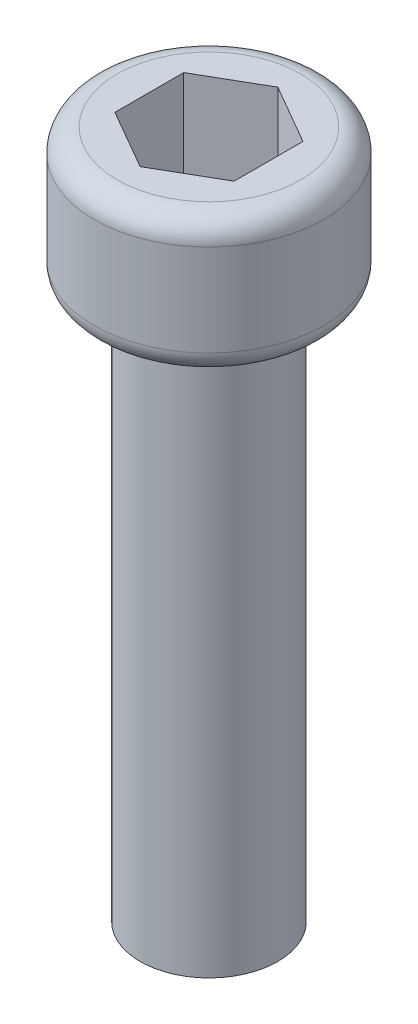
ISO-10303-21;
HEADER;
FILE_DESCRIPTION(('STEP AP214'),'2;1');
FILE_NAME('part.step','',(''),(''),'','','');
FILE_SCHEMA(('AUTOMOTIVE_DESIGN { 1 0 10303 214 1 1 1 1 }'));
ENDSEC;
DATA;
#1=APPLICATION_CONTEXT('core data for automotive mechanical design processes');
#2=APPLICATION_PROTOCOL_DEFINITION('international standard','automotive_design',2000,#1);
#3=PRODUCT_CONTEXT('',#1,'mechanical');
#4=PRODUCT('Part','Part','',(#3));
#5=PRODUCT_RELATED_PRODUCT_CATEGORY('part','',(#4));
#6=PRODUCT_DEFINITION_FORMATION('','',#4);
#7=PRODUCT_DEFINITION_CONTEXT('part definition',#1,'design');
#8=PRODUCT_DEFINITION('design','',#6,#7);
#9=PRODUCT_DEFINITION_SHAPE('','',#8);
#10=(LENGTH_UNIT() NAMED_UNIT(*) SI_UNIT(.MILLI.,.METRE.));
#11=(NAMED_UNIT(*) PLANE_ANGLE_UNIT() SI_UNIT($,.RADIAN.));
#12=(NAMED_UNIT(*) SI_UNIT($,.STERADIAN.) SOLID_ANGLE_UNIT());
#13=UNCERTAINTY_MEASURE_WITH_UNIT(LENGTH_MEASURE(1.E-05),#10,'distance_accuracy_value','');
#14=(GEOMETRIC_REPRESENTATION_CONTEXT(3) GLOBAL_UNCERTAINTY_ASSIGNED_CONTEXT((#13)) GLOBAL_UNIT_ASSIGNED_CONTEXT((#10,
#11,#12)) REPRESENTATION_CONTEXT('',''));
#15=CARTESIAN_POINT('',(0.,0.,0.));
#16=DIRECTION('',(0.,0.,1.));
#17=DIRECTION('',(1.,0.,0.));
#18=AXIS2_PLACEMENT_3D('',#15,#16,#17);
#19=CARTESIAN_POINT('',(0.,3.,0.));
#20=DIRECTION('',(0.,-1.,0.));
#21=DIRECTION('',(0.,0.,-1.));
#22=AXIS2_PLACEMENT_3D('',#19,#20,#21);
#23=CYLINDRICAL_SURFACE('',#22,2.5);
#24=CARTESIAN_POINT('',(0.,0.5,0.));
#25=DIRECTION('',(0.,1.,0.));
#26=DIRECTION('',(0.,0.,1.));
#27=AXIS2_PLACEMENT_3D('',#24,#25,#26);
#28=CIRCLE('',#27,2.5);
#29=CARTESIAN_POINT('',(0.,0.5,2.5));
#30=VERTEX_POINT('',#29);
#31=EDGE_CURVE('E152',#30,#30,#28,.T.);
#32=ORIENTED_EDGE('',*,*,#31,.T.);
#33=EDGE_LOOP('',(#32));
#34=FACE_BOUND('',#33,.T.);
#35=CARTESIAN_POINT('',(0.,2.5,0.));
#36=DIRECTION('',(0.,1.,0.));
#37=DIRECTION('',(0.,0.,1.));
#38=AXIS2_PLACEMENT_3D('',#35,#36,#37);
#39=CIRCLE('',#38,2.5);
#40=CARTESIAN_POINT('',(0.,2.5,2.5));
#41=VERTEX_POINT('',#40);
#42=EDGE_CURVE('E149',#41,#41,#39,.F.);
#43=ORIENTED_EDGE('',*,*,#42,.T.);
#44=EDGE_LOOP('',(#43));
#45=FACE_BOUND('',#44,.T.);
#46=ADVANCED_FACE('F40',(#34,#45),#23,.T.);
#47=CARTESIAN_POINT('',(0.,3.,0.));
#48=DIRECTION('',(0.,1.,0.));
#49=DIRECTION('',(0.,0.,1.));
#50=AXIS2_PLACEMENT_3D('',#47,#48,#49);
#51=PLANE('',#50);
#52=CARTESIAN_POINT('',(0.,3.,0.));
#53=DIRECTION('',(0.,1.,0.));
#54=DIRECTION('',(0.,0.,1.));
#55=AXIS2_PLACEMENT_3D('',#52,#53,#54);
#56=CIRCLE('',#55,2.);
#57=CARTESIAN_POINT('',(0.,3.,2.));
#58=VERTEX_POINT('',#57);
#59=EDGE_CURVE('E11',#58,#58,#56,.T.);
#60=ORIENTED_EDGE('',*,*,#59,.T.);
#61=EDGE_LOOP('',(#60));
#62=FACE_BOUND('',#61,.T.);
#63=DIRECTION('',(-0.866025403784439,0.,-0.5));
#64=VECTOR('',#63,1.);
#65=CARTESIAN_POINT('',(1.29903810567666,3.,-0.750000000000001));
#66=LINE('',#65,#64);
#67=CARTESIAN_POINT('',(1.29903810567666,3.,-0.750000000000001));
#68=VERTEX_POINT('',#67);
#69=CARTESIAN_POINT('',(0.,3.,-1.5));
#70=VERTEX_POINT('',#69);
#71=EDGE_CURVE('E55',#68,#70,#66,.T.);
#72=ORIENTED_EDGE('',*,*,#71,.F.);
#73=DIRECTION('',(0.,0.,-1.));
#74=VECTOR('',#73,1.);
#75=CARTESIAN_POINT('',(1.29903810567666,3.,0.75));
#76=LINE('',#75,#74);
#77=CARTESIAN_POINT('',(1.29903810567666,3.,0.75));
#78=VERTEX_POINT('',#77);
#79=EDGE_CURVE('E139',#78,#68,#76,.T.);
#80=ORIENTED_EDGE('',*,*,#79,.F.);
#81=DIRECTION('',(0.866025403784439,0.,-0.5));
#82=VECTOR('',#81,1.);
#83=CARTESIAN_POINT('',(0.,3.,1.5));
#84=LINE('',#83,#82);
#85=CARTESIAN_POINT('',(0.,3.,1.5));
#86=VERTEX_POINT('',#85);
#87=EDGE_CURVE('E137',#86,#78,#84,.T.);
#88=ORIENTED_EDGE('',*,*,#87,.F.);
#89=DIRECTION('',(0.866025403784439,0.,0.5));
#90=VECTOR('',#89,1.);
#91=CARTESIAN_POINT('',(-1.29903810567666,3.,0.75));
#92=LINE('',#91,#90);
#93=CARTESIAN_POINT('',(-1.29903810567666,3.,0.75));
#94=VERTEX_POINT('',#93);
#95=EDGE_CURVE('E103',#94,#86,#92,.T.);
#96=ORIENTED_EDGE('',*,*,#95,.F.);
#97=DIRECTION('',(0.,0.,1.));
#98=VECTOR('',#97,1.);
#99=CARTESIAN_POINT('',(-1.29903810567666,3.,-0.750000000000001));
#100=LINE('',#99,#98);
#101=CARTESIAN_POINT('',(-1.29903810567666,3.,-0.750000000000001));
#102=VERTEX_POINT('',#101);
#103=EDGE_CURVE('E133',#102,#94,#100,.T.);
#104=ORIENTED_EDGE('',*,*,#103,.F.);
#105=DIRECTION('',(-0.866025403784439,0.,0.5));
#106=VECTOR('',#105,1.);
#107=CARTESIAN_POINT('',(0.,3.,-1.5));
#108=LINE('',#107,#106);
#109=EDGE_CURVE('E129',#70,#102,#108,.T.);
#110=ORIENTED_EDGE('',*,*,#109,.F.);
#111=EDGE_LOOP('',(#72,#80,#88,#96,#104,#110));
#112=FACE_BOUND('',#111,.T.);
#113=ADVANCED_FACE('F168',(#62,#112),#51,.T.);
#114=CARTESIAN_POINT('',(0.,0.,0.));
#115=DIRECTION('',(0.,1.,0.));
#116=DIRECTION('',(0.,0.,1.));
#117=AXIS2_PLACEMENT_3D('',#114,#115,#116);
#118=PLANE('',#117);
#119=CARTESIAN_POINT('',(0.,0.,0.));
#120=DIRECTION('',(0.,1.,0.));
#121=DIRECTION('',(0.,0.,1.));
#122=AXIS2_PLACEMENT_3D('',#119,#120,#121);
#123=CIRCLE('',#122,2.);
#124=CARTESIAN_POINT('',(0.,0.,2.));
#125=VERTEX_POINT('',#124);
#126=EDGE_CURVE('E48',#125,#125,#123,.F.);
#127=ORIENTED_EDGE('',*,*,#126,.T.);
#128=EDGE_LOOP('',(#127));
#129=FACE_BOUND('',#128,.T.);
#130=CARTESIAN_POINT('',(0.,0.,0.));
#131=DIRECTION('',(0.,-1.,0.));
#132=DIRECTION('',(0.,0.,-1.));
#133=AXIS2_PLACEMENT_3D('',#130,#131,#132);
#134=CIRCLE('',#133,1.5);
#135=CARTESIAN_POINT('',(0.,0.,-1.5));
#136=VERTEX_POINT('',#135);
#137=EDGE_CURVE('E143',#136,#136,#134,.T.);
#138=ORIENTED_EDGE('',*,*,#137,.F.);
#139=EDGE_LOOP('',(#138));
#140=FACE_BOUND('',#139,.T.);
#141=ADVANCED_FACE('F157',(#129,#140),#118,.F.);
#142=CARTESIAN_POINT('',(1.29903810567666,1.,-0.750000000000001));
#143=DIRECTION('',(0.5,0.,-0.866025403784439));
#144=DIRECTION('',(-0.866025403784439,0.,-0.5));
#145=AXIS2_PLACEMENT_3D('',#142,#143,#144);
#146=PLANE('',#145);
#147=ORIENTED_EDGE('',*,*,#71,.T.);
#148=DIRECTION('',(0.,1.,0.));
#149=VECTOR('',#148,1.);
#150=CARTESIAN_POINT('',(0.,1.,-1.5));
#151=LINE('',#150,#149);
#152=CARTESIAN_POINT('',(0.,1.,-1.5));
#153=VERTEX_POINT('',#152);
#154=EDGE_CURVE('E85',#153,#70,#151,.T.);
#155=ORIENTED_EDGE('',*,*,#154,.F.);
#156=DIRECTION('',(-0.866025403784439,0.,-0.5));
#157=VECTOR('',#156,1.);
#158=CARTESIAN_POINT('',(1.29903810567666,1.,-0.750000000000001));
#159=LINE('',#158,#157);
#160=CARTESIAN_POINT('',(1.29903810567666,1.,-0.750000000000001));
#161=VERTEX_POINT('',#160);
#162=EDGE_CURVE('E141',#161,#153,#159,.T.);
#163=ORIENTED_EDGE('',*,*,#162,.F.);
#164=DIRECTION('',(0.,1.,0.));
#165=VECTOR('',#164,1.);
#166=CARTESIAN_POINT('',(1.29903810567666,1.,-0.750000000000001));
#167=LINE('',#166,#165);
#168=EDGE_CURVE('E63',#161,#68,#167,.T.);
#169=ORIENTED_EDGE('',*,*,#168,.T.);
#170=EDGE_LOOP('',(#147,#155,#163,#169));
#171=FACE_BOUND('',#170,.T.);
#172=ADVANCED_FACE('F205',(#171),#146,.F.);
#173=CARTESIAN_POINT('',(1.29903810567666,1.,0.75));
#174=DIRECTION('',(1.,0.,0.));
#175=DIRECTION('',(0.,0.,-1.));
#176=AXIS2_PLACEMENT_3D('',#173,#174,#175);
#177=PLANE('',#176);
#178=ORIENTED_EDGE('',*,*,#79,.T.);
#179=ORIENTED_EDGE('',*,*,#168,.F.);
#180=DIRECTION('',(0.,0.,-1.));
#181=VECTOR('',#180,1.);
#182=CARTESIAN_POINT('',(1.29903810567666,1.,0.75));
#183=LINE('',#182,#181);
#184=CARTESIAN_POINT('',(1.29903810567666,1.,0.75));
#185=VERTEX_POINT('',#184);
#186=EDGE_CURVE('E115',#185,#161,#183,.T.);
#187=ORIENTED_EDGE('',*,*,#186,.F.);
#188=DIRECTION('',(0.,1.,0.));
#189=VECTOR('',#188,1.);
#190=CARTESIAN_POINT('',(1.29903810567666,1.,0.75));
#191=LINE('',#190,#189);
#192=EDGE_CURVE('E107',#185,#78,#191,.T.);
#193=ORIENTED_EDGE('',*,*,#192,.T.);
#194=EDGE_LOOP('',(#178,#179,#187,#193));
#195=FACE_BOUND('',#194,.T.);
#196=ADVANCED_FACE('F202',(#195),#177,.F.);
#197=CARTESIAN_POINT('',(0.,1.,1.5));
#198=DIRECTION('',(0.5,0.,0.866025403784439));
#199=DIRECTION('',(0.866025403784439,0.,-0.5));
#200=AXIS2_PLACEMENT_3D('',#197,#198,#199);
#201=PLANE('',#200);
#202=ORIENTED_EDGE('',*,*,#87,.T.);
#203=ORIENTED_EDGE('',*,*,#192,.F.);
#204=DIRECTION('',(0.866025403784439,0.,-0.5));
#205=VECTOR('',#204,1.);
#206=CARTESIAN_POINT('',(0.,1.,1.5));
#207=LINE('',#206,#205);
#208=CARTESIAN_POINT('',(0.,1.,1.5));
#209=VERTEX_POINT('',#208);
#210=EDGE_CURVE('E111',#209,#185,#207,.T.);
#211=ORIENTED_EDGE('',*,*,#210,.F.);
#212=DIRECTION('',(0.,1.,0.));
#213=VECTOR('',#212,1.);
#214=CARTESIAN_POINT('',(0.,1.,1.5));
#215=LINE('',#214,#213);
#216=EDGE_CURVE('E96',#209,#86,#215,.T.);
#217=ORIENTED_EDGE('',*,*,#216,.T.);
#218=EDGE_LOOP('',(#202,#203,#211,#217));
#219=FACE_BOUND('',#218,.T.);
#220=ADVANCED_FACE('F112',(#219),#201,.F.);
#221=CARTESIAN_POINT('',(-1.29903810567666,1.,0.75));
#222=DIRECTION('',(-0.5,0.,0.866025403784439));
#223=DIRECTION('',(0.866025403784439,0.,0.5));
#224=AXIS2_PLACEMENT_3D('',#221,#222,#223);
#225=PLANE('',#224);
#226=ORIENTED_EDGE('',*,*,#95,.T.);
#227=ORIENTED_EDGE('',*,*,#216,.F.);
#228=DIRECTION('',(0.866025403784439,0.,0.5));
#229=VECTOR('',#228,1.);
#230=CARTESIAN_POINT('',(-1.29903810567666,1.,0.75));
#231=LINE('',#230,#229);
#232=CARTESIAN_POINT('',(-1.29903810567666,1.,0.75));
#233=VERTEX_POINT('',#232);
#234=EDGE_CURVE('E100',#233,#209,#231,.T.);
#235=ORIENTED_EDGE('',*,*,#234,.F.);
#236=DIRECTION('',(0.,1.,0.));
#237=VECTOR('',#236,1.);
#238=CARTESIAN_POINT('',(-1.29903810567666,1.,0.75));
#239=LINE('',#238,#237);
#240=EDGE_CURVE('E108',#233,#94,#239,.T.);
#241=ORIENTED_EDGE('',*,*,#240,.T.);
#242=EDGE_LOOP('',(#226,#227,#235,#241));
#243=FACE_BOUND('',#242,.T.);
#244=ADVANCED_FACE('F98',(#243),#225,.F.);
#245=CARTESIAN_POINT('',(-1.29903810567666,1.,-0.750000000000001));
#246=DIRECTION('',(-1.,0.,0.));
#247=DIRECTION('',(0.,0.,1.));
#248=AXIS2_PLACEMENT_3D('',#245,#246,#247);
#249=PLANE('',#248);
#250=ORIENTED_EDGE('',*,*,#103,.T.);
#251=ORIENTED_EDGE('',*,*,#240,.F.);
#252=DIRECTION('',(0.,0.,1.));
#253=VECTOR('',#252,1.);
#254=CARTESIAN_POINT('',(-1.29903810567666,1.,-0.750000000000001));
#255=LINE('',#254,#253);
#256=CARTESIAN_POINT('',(-1.29903810567666,1.,-0.750000000000001));
#257=VERTEX_POINT('',#256);
#258=EDGE_CURVE('E121',#257,#233,#255,.T.);
#259=ORIENTED_EDGE('',*,*,#258,.F.);
#260=DIRECTION('',(0.,1.,0.));
#261=VECTOR('',#260,1.);
#262=CARTESIAN_POINT('',(-1.29903810567666,1.,-0.750000000000001));
#263=LINE('',#262,#261);
#264=EDGE_CURVE('E146',#257,#102,#263,.T.);
#265=ORIENTED_EDGE('',*,*,#264,.T.);
#266=EDGE_LOOP('',(#250,#251,#259,#265));
#267=FACE_BOUND('',#266,.T.);
#268=ADVANCED_FACE('F210',(#267),#249,.F.);
#269=CARTESIAN_POINT('',(0.,1.,-1.5));
#270=DIRECTION('',(-0.5,0.,-0.866025403784439));
#271=DIRECTION('',(-0.866025403784439,0.,0.5));
#272=AXIS2_PLACEMENT_3D('',#269,#270,#271);
#273=PLANE('',#272);
#274=ORIENTED_EDGE('',*,*,#109,.T.);
#275=ORIENTED_EDGE('',*,*,#264,.F.);
#276=DIRECTION('',(-0.866025403784439,0.,0.5));
#277=VECTOR('',#276,1.);
#278=CARTESIAN_POINT('',(0.,1.,-1.5));
#279=LINE('',#278,#277);
#280=EDGE_CURVE('E123',#153,#257,#279,.T.);
#281=ORIENTED_EDGE('',*,*,#280,.F.);
#282=ORIENTED_EDGE('',*,*,#154,.T.);
#283=EDGE_LOOP('',(#274,#275,#281,#282));
#284=FACE_BOUND('',#283,.T.);
#285=ADVANCED_FACE('F184',(#284),#273,.F.);
#286=CARTESIAN_POINT('',(0.,1.,0.));
#287=DIRECTION('',(0.,1.,0.));
#288=DIRECTION('',(0.,0.,1.));
#289=AXIS2_PLACEMENT_3D('',#286,#287,#288);
#290=PLANE('',#289);
#291=ORIENTED_EDGE('',*,*,#162,.T.);
#292=ORIENTED_EDGE('',*,*,#280,.T.);
#293=ORIENTED_EDGE('',*,*,#258,.T.);
#294=ORIENTED_EDGE('',*,*,#234,.T.);
#295=ORIENTED_EDGE('',*,*,#210,.T.);
#296=ORIENTED_EDGE('',*,*,#186,.T.);
#297=EDGE_LOOP('',(#291,#292,#293,#294,#295,#296));
#298=FACE_BOUND('',#297,.T.);
#299=ADVANCED_FACE('F118',(#298),#290,.T.);
#300=CARTESIAN_POINT('',(0.,-10.,0.));
#301=DIRECTION('',(0.,1.,0.));
#302=DIRECTION('',(0.,0.,1.));
#303=AXIS2_PLACEMENT_3D('',#300,#301,#302);
#304=CYLINDRICAL_SURFACE('',#303,1.5);
#305=ORIENTED_EDGE('',*,*,#137,.T.);
#306=EDGE_LOOP('',(#305));
#307=FACE_BOUND('',#306,.T.);
#308=CARTESIAN_POINT('',(0.,-12.,0.));
#309=DIRECTION('',(0.,-1.,0.));
#310=DIRECTION('',(0.,0.,-1.));
#311=AXIS2_PLACEMENT_3D('',#308,#309,#310);
#312=CIRCLE('',#311,1.5);
#313=CARTESIAN_POINT('',(0.,-12.,-1.5));
#314=VERTEX_POINT('',#313);
#315=EDGE_CURVE('E130',#314,#314,#312,.T.);
#316=ORIENTED_EDGE('',*,*,#315,.F.);
#317=EDGE_LOOP('',(#316));
#318=FACE_BOUND('',#317,.T.);
#319=ADVANCED_FACE('F163',(#307,#318),#304,.T.);
#320=CARTESIAN_POINT('',(0.,0.5,0.));
#321=DIRECTION('',(0.,1.,0.));
#322=DIRECTION('',(0.,0.,1.));
#323=AXIS2_PLACEMENT_3D('',#320,#321,#322);
#324=TOROIDAL_SURFACE('',#323,2.,0.5);
#325=ORIENTED_EDGE('',*,*,#126,.F.);
#326=EDGE_LOOP('',(#325));
#327=FACE_BOUND('',#326,.T.);
#328=ORIENTED_EDGE('',*,*,#31,.F.);
#329=EDGE_LOOP('',(#328));
#330=FACE_BOUND('',#329,.T.);
#331=ADVANCED_FACE('F160',(#327,#330),#324,.T.);
#332=CARTESIAN_POINT('',(0.,2.5,0.));
#333=DIRECTION('',(0.,1.,0.));
#334=DIRECTION('',(0.,0.,1.));
#335=AXIS2_PLACEMENT_3D('',#332,#333,#334);
#336=TOROIDAL_SURFACE('',#335,2.,0.5);
#337=ORIENTED_EDGE('',*,*,#42,.F.);
#338=EDGE_LOOP('',(#337));
#339=FACE_BOUND('',#338,.T.);
#340=ORIENTED_EDGE('',*,*,#59,.F.);
#341=EDGE_LOOP('',(#340));
#342=FACE_BOUND('',#341,.T.);
#343=ADVANCED_FACE('F42',(#339,#342),#336,.T.);
#344=CARTESIAN_POINT('',(0.,-12.,0.));
#345=DIRECTION('',(0.,-1.,0.));
#346=DIRECTION('',(0.,0.,-1.));
#347=AXIS2_PLACEMENT_3D('',#344,#345,#346);
#348=PLANE('',#347);
#349=ORIENTED_EDGE('',*,*,#315,.T.);
#350=EDGE_LOOP('',(#349));
#351=FACE_BOUND('',#350,.T.);
#352=ADVANCED_FACE('F174',(#351),#348,.T.);
#353=CLOSED_SHELL('',(#46,#113,#141,#172,#196,#220,#244,#268,#285,#299,#319,#331,#343,#352));
#354=MANIFOLD_SOLID_BREP('B2',#353);
#355=ADVANCED_BREP_SHAPE_REPRESENTATION('',(#18,#354),#14);
#356=SHAPE_DEFINITION_REPRESENTATION(#9,#355);
ENDSEC;
END-ISO-10303-21;
